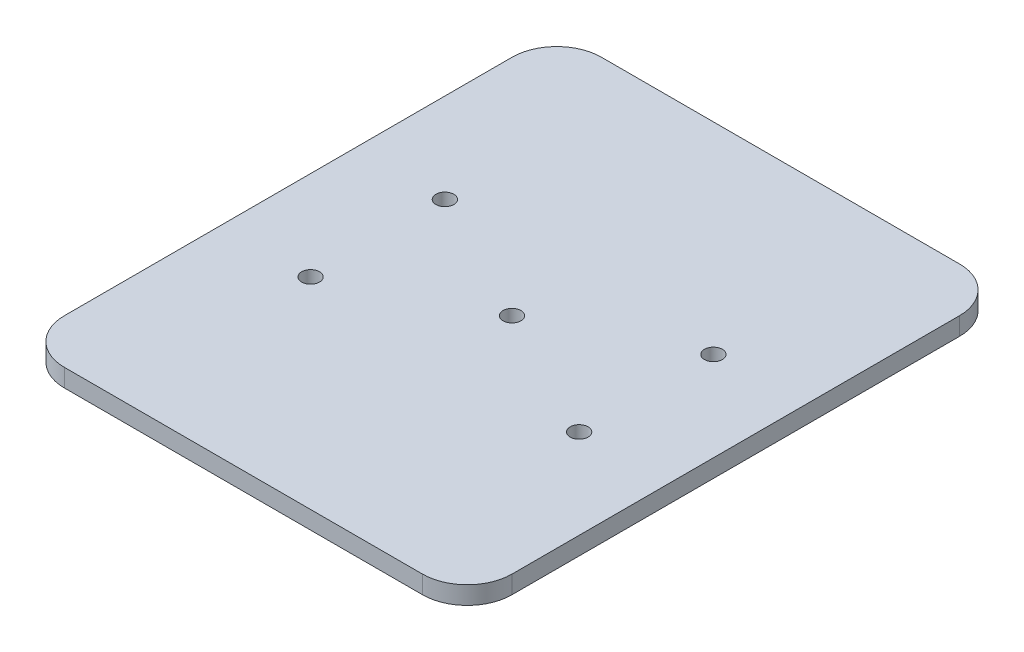
ISO-10303-21;
HEADER;
FILE_DESCRIPTION(('STEP AP214'),'2;1');
FILE_NAME('part.step','',(''),(''),'','','');
FILE_SCHEMA(('AUTOMOTIVE_DESIGN { 1 0 10303 214 1 1 1 1 }'));
ENDSEC;
DATA;
#1=APPLICATION_CONTEXT('core data for automotive mechanical design processes');
#2=APPLICATION_PROTOCOL_DEFINITION('international standard','automotive_design',2000,#1);
#3=PRODUCT_CONTEXT('',#1,'mechanical');
#4=PRODUCT('Part','Part','',(#3));
#5=PRODUCT_RELATED_PRODUCT_CATEGORY('part','',(#4));
#6=PRODUCT_DEFINITION_FORMATION('','',#4);
#7=PRODUCT_DEFINITION_CONTEXT('part definition',#1,'design');
#8=PRODUCT_DEFINITION('design','',#6,#7);
#9=PRODUCT_DEFINITION_SHAPE('','',#8);
#10=(LENGTH_UNIT() NAMED_UNIT(*) SI_UNIT(.MILLI.,.METRE.));
#11=(NAMED_UNIT(*) PLANE_ANGLE_UNIT() SI_UNIT($,.RADIAN.));
#12=(NAMED_UNIT(*) SI_UNIT($,.STERADIAN.) SOLID_ANGLE_UNIT());
#13=UNCERTAINTY_MEASURE_WITH_UNIT(LENGTH_MEASURE(1.E-05),#10,'distance_accuracy_value','');
#14=(GEOMETRIC_REPRESENTATION_CONTEXT(3) GLOBAL_UNCERTAINTY_ASSIGNED_CONTEXT((#13)) GLOBAL_UNIT_ASSIGNED_CONTEXT((#10,
#11,#12)) REPRESENTATION_CONTEXT('',''));
#15=CARTESIAN_POINT('',(0.,0.,0.));
#16=DIRECTION('',(0.,0.,1.));
#17=DIRECTION('',(1.,0.,0.));
#18=AXIS2_PLACEMENT_3D('',#15,#16,#17);
#19=CARTESIAN_POINT('',(-52.2549019607844,2.,28.7254901960784));
#20=DIRECTION('',(0.,1.,0.));
#21=DIRECTION('',(0.,0.,1.));
#22=AXIS2_PLACEMENT_3D('',#19,#20,#21);
#23=PLANE('',#22);
#24=CARTESIAN_POINT('',(-17.2549019607844,2.,-3.77450980392158));
#25=DIRECTION('',(0.,1.,0.));
#26=DIRECTION('',(0.,0.,1.));
#27=AXIS2_PLACEMENT_3D('',#24,#25,#26);
#28=CIRCLE('',#27,1.);
#29=CARTESIAN_POINT('',(-17.2549019607844,2.,-2.77450980392158));
#30=VERTEX_POINT('',#29);
#31=EDGE_CURVE('E202',#30,#30,#28,.T.);
#32=ORIENTED_EDGE('',*,*,#31,.F.);
#33=EDGE_LOOP('',(#32));
#34=FACE_BOUND('',#33,.T.);
#35=CARTESIAN_POINT('',(-47.2549019607844,2.,-3.77450980392158));
#36=DIRECTION('',(0.,1.,0.));
#37=DIRECTION('',(0.,0.,1.));
#38=AXIS2_PLACEMENT_3D('',#35,#36,#37);
#39=CIRCLE('',#38,0.999999999999998);
#40=CARTESIAN_POINT('',(-47.2549019607844,2.,-2.77450980392158));
#41=VERTEX_POINT('',#40);
#42=EDGE_CURVE('E190',#41,#41,#39,.T.);
#43=ORIENTED_EDGE('',*,*,#42,.F.);
#44=EDGE_LOOP('',(#43));
#45=FACE_BOUND('',#44,.T.);
#46=CARTESIAN_POINT('',(-52.2549019607844,2.,28.7254901960784));
#47=DIRECTION('',(0.,1.,0.));
#48=DIRECTION('',(0.,0.,1.));
#49=AXIS2_PLACEMENT_3D('',#46,#47,#48);
#50=CIRCLE('',#49,5.);
#51=CARTESIAN_POINT('',(-57.2549019607844,2.,28.7254901960784));
#52=VERTEX_POINT('',#51);
#53=CARTESIAN_POINT('',(-52.2549019607843,2.,33.7254901960784));
#54=VERTEX_POINT('',#53);
#55=EDGE_CURVE('E153',#52,#54,#50,.T.);
#56=ORIENTED_EDGE('',*,*,#55,.T.);
#57=DIRECTION('',(1.,0.,0.));
#58=VECTOR('',#57,1.);
#59=CARTESIAN_POINT('',(-52.2549019607843,2.,33.7254901960784));
#60=LINE('',#59,#58);
#61=CARTESIAN_POINT('',(-12.2549019607844,2.,33.7254901960784));
#62=VERTEX_POINT('',#61);
#63=EDGE_CURVE('E101',#54,#62,#60,.T.);
#64=ORIENTED_EDGE('',*,*,#63,.T.);
#65=CARTESIAN_POINT('',(-12.2549019607843,2.,28.7254901960784));
#66=DIRECTION('',(0.,1.,0.));
#67=DIRECTION('',(0.,0.,1.));
#68=AXIS2_PLACEMENT_3D('',#65,#66,#67);
#69=CIRCLE('',#68,5.);
#70=CARTESIAN_POINT('',(-7.25490196078435,2.,28.7254901960784));
#71=VERTEX_POINT('',#70);
#72=EDGE_CURVE('E168',#62,#71,#69,.T.);
#73=ORIENTED_EDGE('',*,*,#72,.T.);
#74=DIRECTION('',(0.,0.,-1.));
#75=VECTOR('',#74,1.);
#76=CARTESIAN_POINT('',(-7.25490196078435,2.,-21.2745098039215));
#77=LINE('',#76,#75);
#78=CARTESIAN_POINT('',(-7.25490196078435,2.,-21.2745098039215));
#79=VERTEX_POINT('',#78);
#80=EDGE_CURVE('E181',#71,#79,#77,.T.);
#81=ORIENTED_EDGE('',*,*,#80,.T.);
#82=CARTESIAN_POINT('',(-12.2549019607843,2.,-21.2745098039216));
#83=DIRECTION('',(0.,1.,0.));
#84=DIRECTION('',(0.,0.,-1.));
#85=AXIS2_PLACEMENT_3D('',#82,#83,#84);
#86=CIRCLE('',#85,5.);
#87=CARTESIAN_POINT('',(-12.2549019607844,2.,-26.2745098039216));
#88=VERTEX_POINT('',#87);
#89=EDGE_CURVE('E120',#79,#88,#86,.T.);
#90=ORIENTED_EDGE('',*,*,#89,.T.);
#91=DIRECTION('',(-1.,0.,0.));
#92=VECTOR('',#91,1.);
#93=CARTESIAN_POINT('',(-52.2549019607843,2.,-26.2745098039216));
#94=LINE('',#93,#92);
#95=CARTESIAN_POINT('',(-52.2549019607843,2.,-26.2745098039216));
#96=VERTEX_POINT('',#95);
#97=EDGE_CURVE('E114',#88,#96,#94,.T.);
#98=ORIENTED_EDGE('',*,*,#97,.T.);
#99=CARTESIAN_POINT('',(-52.2549019607844,2.,-21.2745098039216));
#100=DIRECTION('',(0.,1.,0.));
#101=DIRECTION('',(0.,0.,1.));
#102=AXIS2_PLACEMENT_3D('',#99,#100,#101);
#103=CIRCLE('',#102,5.);
#104=CARTESIAN_POINT('',(-57.2549019607844,2.,-21.2745098039215));
#105=VERTEX_POINT('',#104);
#106=EDGE_CURVE('E118',#96,#105,#103,.T.);
#107=ORIENTED_EDGE('',*,*,#106,.T.);
#108=DIRECTION('',(0.,0.,1.));
#109=VECTOR('',#108,1.);
#110=CARTESIAN_POINT('',(-57.2549019607844,2.,-21.2745098039215));
#111=LINE('',#110,#109);
#112=EDGE_CURVE('E58',#105,#52,#111,.T.);
#113=ORIENTED_EDGE('',*,*,#112,.T.);
#114=EDGE_LOOP('',(#56,#64,#73,#81,#90,#98,#107,#113));
#115=FACE_BOUND('',#114,.T.);
#116=CARTESIAN_POINT('',(-32.2549019607844,2.,3.72549019607842));
#117=DIRECTION('',(0.,1.,0.));
#118=DIRECTION('',(0.,0.,1.));
#119=AXIS2_PLACEMENT_3D('',#116,#117,#118);
#120=CIRCLE('',#119,0.999999999999998);
#121=CARTESIAN_POINT('',(-32.2549019607844,2.,4.72549019607842));
#122=VERTEX_POINT('',#121);
#123=EDGE_CURVE('E142',#122,#122,#120,.T.);
#124=ORIENTED_EDGE('',*,*,#123,.F.);
#125=EDGE_LOOP('',(#124));
#126=FACE_BOUND('',#125,.T.);
#127=CARTESIAN_POINT('',(-47.2549019607844,2.,11.2254901960784));
#128=DIRECTION('',(0.,1.,0.));
#129=DIRECTION('',(0.,0.,1.));
#130=AXIS2_PLACEMENT_3D('',#127,#128,#129);
#131=CIRCLE('',#130,0.999999999999998);
#132=CARTESIAN_POINT('',(-47.2549019607844,2.,12.2254901960784));
#133=VERTEX_POINT('',#132);
#134=EDGE_CURVE('E196',#133,#133,#131,.T.);
#135=ORIENTED_EDGE('',*,*,#134,.F.);
#136=EDGE_LOOP('',(#135));
#137=FACE_BOUND('',#136,.T.);
#138=CARTESIAN_POINT('',(-17.2549019607844,2.,11.2254901960784));
#139=DIRECTION('',(0.,1.,0.));
#140=DIRECTION('',(0.,0.,1.));
#141=AXIS2_PLACEMENT_3D('',#138,#139,#140);
#142=CIRCLE('',#141,1.);
#143=CARTESIAN_POINT('',(-17.2549019607844,2.,12.2254901960784));
#144=VERTEX_POINT('',#143);
#145=EDGE_CURVE('E208',#144,#144,#142,.T.);
#146=ORIENTED_EDGE('',*,*,#145,.F.);
#147=EDGE_LOOP('',(#146));
#148=FACE_BOUND('',#147,.T.);
#149=ADVANCED_FACE('F41',(#34,#45,#115,#126,#137,#148),#23,.T.);
#150=CARTESIAN_POINT('',(-52.2549019607844,0.,28.7254901960784));
#151=DIRECTION('',(0.,1.,0.));
#152=DIRECTION('',(0.,0.,1.));
#153=AXIS2_PLACEMENT_3D('',#150,#151,#152);
#154=PLANE('',#153);
#155=CARTESIAN_POINT('',(-52.2549019607844,0.,28.7254901960784));
#156=DIRECTION('',(0.,1.,0.));
#157=DIRECTION('',(0.,0.,1.));
#158=AXIS2_PLACEMENT_3D('',#155,#156,#157);
#159=CIRCLE('',#158,5.);
#160=CARTESIAN_POINT('',(-57.2549019607844,0.,28.7254901960784));
#161=VERTEX_POINT('',#160);
#162=CARTESIAN_POINT('',(-52.2549019607843,0.,33.7254901960784));
#163=VERTEX_POINT('',#162);
#164=EDGE_CURVE('E138',#161,#163,#159,.T.);
#165=ORIENTED_EDGE('',*,*,#164,.F.);
#166=DIRECTION('',(0.,0.,1.));
#167=VECTOR('',#166,1.);
#168=CARTESIAN_POINT('',(-57.2549019607844,0.,-21.2745098039215));
#169=LINE('',#168,#167);
#170=CARTESIAN_POINT('',(-57.2549019607844,0.,-21.2745098039215));
#171=VERTEX_POINT('',#170);
#172=EDGE_CURVE('E93',#171,#161,#169,.T.);
#173=ORIENTED_EDGE('',*,*,#172,.F.);
#174=CARTESIAN_POINT('',(-52.2549019607844,0.,-21.2745098039216));
#175=DIRECTION('',(0.,1.,0.));
#176=DIRECTION('',(0.,0.,1.));
#177=AXIS2_PLACEMENT_3D('',#174,#175,#176);
#178=CIRCLE('',#177,5.);
#179=CARTESIAN_POINT('',(-52.2549019607843,0.,-26.2745098039216));
#180=VERTEX_POINT('',#179);
#181=EDGE_CURVE('E87',#180,#171,#178,.T.);
#182=ORIENTED_EDGE('',*,*,#181,.F.);
#183=DIRECTION('',(-1.,0.,0.));
#184=VECTOR('',#183,1.);
#185=CARTESIAN_POINT('',(-52.2549019607843,0.,-26.2745098039216));
#186=LINE('',#185,#184);
#187=CARTESIAN_POINT('',(-12.2549019607844,0.,-26.2745098039216));
#188=VERTEX_POINT('',#187);
#189=EDGE_CURVE('E128',#188,#180,#186,.T.);
#190=ORIENTED_EDGE('',*,*,#189,.F.);
#191=CARTESIAN_POINT('',(-12.2549019607843,0.,-21.2745098039216));
#192=DIRECTION('',(0.,1.,0.));
#193=DIRECTION('',(0.,0.,-1.));
#194=AXIS2_PLACEMENT_3D('',#191,#192,#193);
#195=CIRCLE('',#194,5.);
#196=CARTESIAN_POINT('',(-7.25490196078435,0.,-21.2745098039215));
#197=VERTEX_POINT('',#196);
#198=EDGE_CURVE('E148',#197,#188,#195,.T.);
#199=ORIENTED_EDGE('',*,*,#198,.F.);
#200=DIRECTION('',(0.,0.,-1.));
#201=VECTOR('',#200,1.);
#202=CARTESIAN_POINT('',(-7.25490196078435,0.,-21.2745098039215));
#203=LINE('',#202,#201);
#204=CARTESIAN_POINT('',(-7.25490196078435,0.,28.7254901960784));
#205=VERTEX_POINT('',#204);
#206=EDGE_CURVE('E146',#205,#197,#203,.T.);
#207=ORIENTED_EDGE('',*,*,#206,.F.);
#208=CARTESIAN_POINT('',(-12.2549019607843,0.,28.7254901960784));
#209=DIRECTION('',(0.,1.,0.));
#210=DIRECTION('',(0.,0.,1.));
#211=AXIS2_PLACEMENT_3D('',#208,#209,#210);
#212=CIRCLE('',#211,5.);
#213=CARTESIAN_POINT('',(-12.2549019607844,0.,33.7254901960784));
#214=VERTEX_POINT('',#213);
#215=EDGE_CURVE('E144',#214,#205,#212,.T.);
#216=ORIENTED_EDGE('',*,*,#215,.F.);
#217=DIRECTION('',(1.,0.,0.));
#218=VECTOR('',#217,1.);
#219=CARTESIAN_POINT('',(-52.2549019607843,0.,33.7254901960784));
#220=LINE('',#219,#218);
#221=EDGE_CURVE('E141',#163,#214,#220,.T.);
#222=ORIENTED_EDGE('',*,*,#221,.F.);
#223=EDGE_LOOP('',(#165,#173,#182,#190,#199,#207,#216,#222));
#224=FACE_BOUND('',#223,.T.);
#225=CARTESIAN_POINT('',(-32.2549019607844,0.,3.72549019607842));
#226=DIRECTION('',(0.,1.,0.));
#227=DIRECTION('',(0.,0.,1.));
#228=AXIS2_PLACEMENT_3D('',#225,#226,#227);
#229=CIRCLE('',#228,0.999999999999998);
#230=CARTESIAN_POINT('',(-32.2549019607844,0.,4.72549019607842));
#231=VERTEX_POINT('',#230);
#232=EDGE_CURVE('E187',#231,#231,#229,.T.);
#233=ORIENTED_EDGE('',*,*,#232,.T.);
#234=EDGE_LOOP('',(#233));
#235=FACE_BOUND('',#234,.T.);
#236=CARTESIAN_POINT('',(-47.2549019607844,0.,-3.77450980392158));
#237=DIRECTION('',(0.,1.,0.));
#238=DIRECTION('',(0.,0.,1.));
#239=AXIS2_PLACEMENT_3D('',#236,#237,#238);
#240=CIRCLE('',#239,0.999999999999998);
#241=CARTESIAN_POINT('',(-47.2549019607844,0.,-2.77450980392158));
#242=VERTEX_POINT('',#241);
#243=EDGE_CURVE('E193',#242,#242,#240,.T.);
#244=ORIENTED_EDGE('',*,*,#243,.T.);
#245=EDGE_LOOP('',(#244));
#246=FACE_BOUND('',#245,.T.);
#247=CARTESIAN_POINT('',(-47.2549019607844,0.,11.2254901960784));
#248=DIRECTION('',(0.,1.,0.));
#249=DIRECTION('',(0.,0.,1.));
#250=AXIS2_PLACEMENT_3D('',#247,#248,#249);
#251=CIRCLE('',#250,0.999999999999998);
#252=CARTESIAN_POINT('',(-47.2549019607844,0.,12.2254901960784));
#253=VERTEX_POINT('',#252);
#254=EDGE_CURVE('E199',#253,#253,#251,.T.);
#255=ORIENTED_EDGE('',*,*,#254,.T.);
#256=EDGE_LOOP('',(#255));
#257=FACE_BOUND('',#256,.T.);
#258=CARTESIAN_POINT('',(-17.2549019607844,0.,-3.77450980392158));
#259=DIRECTION('',(0.,1.,0.));
#260=DIRECTION('',(0.,0.,1.));
#261=AXIS2_PLACEMENT_3D('',#258,#259,#260);
#262=CIRCLE('',#261,1.);
#263=CARTESIAN_POINT('',(-17.2549019607844,0.,-2.77450980392158));
#264=VERTEX_POINT('',#263);
#265=EDGE_CURVE('E205',#264,#264,#262,.T.);
#266=ORIENTED_EDGE('',*,*,#265,.T.);
#267=EDGE_LOOP('',(#266));
#268=FACE_BOUND('',#267,.T.);
#269=CARTESIAN_POINT('',(-17.2549019607844,0.,11.2254901960784));
#270=DIRECTION('',(0.,1.,0.));
#271=DIRECTION('',(0.,0.,1.));
#272=AXIS2_PLACEMENT_3D('',#269,#270,#271);
#273=CIRCLE('',#272,1.);
#274=CARTESIAN_POINT('',(-17.2549019607844,0.,12.2254901960784));
#275=VERTEX_POINT('',#274);
#276=EDGE_CURVE('E211',#275,#275,#273,.T.);
#277=ORIENTED_EDGE('',*,*,#276,.T.);
#278=EDGE_LOOP('',(#277));
#279=FACE_BOUND('',#278,.T.);
#280=ADVANCED_FACE('F172',(#224,#235,#246,#257,#268,#279),#154,.F.);
#281=CARTESIAN_POINT('',(-52.2549019607844,2.,28.7254901960784));
#282=DIRECTION('',(0.,-1.,0.));
#283=DIRECTION('',(0.,0.,-1.));
#284=AXIS2_PLACEMENT_3D('',#281,#282,#283);
#285=CYLINDRICAL_SURFACE('',#284,5.);
#286=ORIENTED_EDGE('',*,*,#164,.T.);
#287=DIRECTION('',(0.,-1.,0.));
#288=VECTOR('',#287,1.);
#289=CARTESIAN_POINT('',(-52.2549019607843,2.,33.7254901960784));
#290=LINE('',#289,#288);
#291=EDGE_CURVE('E11',#54,#163,#290,.T.);
#292=ORIENTED_EDGE('',*,*,#291,.F.);
#293=ORIENTED_EDGE('',*,*,#55,.F.);
#294=DIRECTION('',(0.,-1.,0.));
#295=VECTOR('',#294,1.);
#296=CARTESIAN_POINT('',(-57.2549019607844,2.,28.7254901960784));
#297=LINE('',#296,#295);
#298=EDGE_CURVE('E134',#52,#161,#297,.T.);
#299=ORIENTED_EDGE('',*,*,#298,.T.);
#300=EDGE_LOOP('',(#286,#292,#293,#299));
#301=FACE_BOUND('',#300,.T.);
#302=ADVANCED_FACE('F43',(#301),#285,.T.);
#303=CARTESIAN_POINT('',(-52.2549019607843,2.,33.7254901960784));
#304=DIRECTION('',(0.,0.,-1.));
#305=DIRECTION('',(-1.,0.,0.));
#306=AXIS2_PLACEMENT_3D('',#303,#304,#305);
#307=PLANE('',#306);
#308=ORIENTED_EDGE('',*,*,#221,.T.);
#309=DIRECTION('',(0.,-1.,0.));
#310=VECTOR('',#309,1.);
#311=CARTESIAN_POINT('',(-12.2549019607844,2.,33.7254901960784));
#312=LINE('',#311,#310);
#313=EDGE_CURVE('E50',#62,#214,#312,.T.);
#314=ORIENTED_EDGE('',*,*,#313,.F.);
#315=ORIENTED_EDGE('',*,*,#63,.F.);
#316=ORIENTED_EDGE('',*,*,#291,.T.);
#317=EDGE_LOOP('',(#308,#314,#315,#316));
#318=FACE_BOUND('',#317,.T.);
#319=ADVANCED_FACE('F245',(#318),#307,.F.);
#320=CARTESIAN_POINT('',(-12.2549019607843,2.,28.7254901960784));
#321=DIRECTION('',(0.,-1.,0.));
#322=DIRECTION('',(0.,0.,-1.));
#323=AXIS2_PLACEMENT_3D('',#320,#321,#322);
#324=CYLINDRICAL_SURFACE('',#323,5.);
#325=ORIENTED_EDGE('',*,*,#215,.T.);
#326=DIRECTION('',(0.,-1.,0.));
#327=VECTOR('',#326,1.);
#328=CARTESIAN_POINT('',(-7.25490196078435,2.,28.7254901960784));
#329=LINE('',#328,#327);
#330=EDGE_CURVE('E160',#71,#205,#329,.T.);
#331=ORIENTED_EDGE('',*,*,#330,.F.);
#332=ORIENTED_EDGE('',*,*,#72,.F.);
#333=ORIENTED_EDGE('',*,*,#313,.T.);
#334=EDGE_LOOP('',(#325,#331,#332,#333));
#335=FACE_BOUND('',#334,.T.);
#336=ADVANCED_FACE('F166',(#335),#324,.T.);
#337=CARTESIAN_POINT('',(-7.25490196078435,2.,-21.2745098039215));
#338=DIRECTION('',(-1.,0.,0.));
#339=DIRECTION('',(0.,0.,1.));
#340=AXIS2_PLACEMENT_3D('',#337,#338,#339);
#341=PLANE('',#340);
#342=ORIENTED_EDGE('',*,*,#206,.T.);
#343=DIRECTION('',(0.,-1.,0.));
#344=VECTOR('',#343,1.);
#345=CARTESIAN_POINT('',(-7.25490196078435,2.,-21.2745098039215));
#346=LINE('',#345,#344);
#347=EDGE_CURVE('E157',#79,#197,#346,.T.);
#348=ORIENTED_EDGE('',*,*,#347,.F.);
#349=ORIENTED_EDGE('',*,*,#80,.F.);
#350=ORIENTED_EDGE('',*,*,#330,.T.);
#351=EDGE_LOOP('',(#342,#348,#349,#350));
#352=FACE_BOUND('',#351,.T.);
#353=ADVANCED_FACE('F177',(#352),#341,.F.);
#354=CARTESIAN_POINT('',(-12.2549019607843,2.,-21.2745098039216));
#355=DIRECTION('',(0.,-1.,0.));
#356=DIRECTION('',(0.,0.,-1.));
#357=AXIS2_PLACEMENT_3D('',#354,#355,#356);
#358=CYLINDRICAL_SURFACE('',#357,5.);
#359=ORIENTED_EDGE('',*,*,#198,.T.);
#360=DIRECTION('',(0.,-1.,0.));
#361=VECTOR('',#360,1.);
#362=CARTESIAN_POINT('',(-12.2549019607844,2.,-26.2745098039216));
#363=LINE('',#362,#361);
#364=EDGE_CURVE('E129',#88,#188,#363,.T.);
#365=ORIENTED_EDGE('',*,*,#364,.F.);
#366=ORIENTED_EDGE('',*,*,#89,.F.);
#367=ORIENTED_EDGE('',*,*,#347,.T.);
#368=EDGE_LOOP('',(#359,#365,#366,#367));
#369=FACE_BOUND('',#368,.T.);
#370=ADVANCED_FACE('F180',(#369),#358,.T.);
#371=CARTESIAN_POINT('',(-52.2549019607843,2.,-26.2745098039216));
#372=DIRECTION('',(0.,0.,1.));
#373=DIRECTION('',(1.,0.,0.));
#374=AXIS2_PLACEMENT_3D('',#371,#372,#373);
#375=PLANE('',#374);
#376=ORIENTED_EDGE('',*,*,#189,.T.);
#377=DIRECTION('',(0.,-1.,0.));
#378=VECTOR('',#377,1.);
#379=CARTESIAN_POINT('',(-52.2549019607843,2.,-26.2745098039216));
#380=LINE('',#379,#378);
#381=EDGE_CURVE('E125',#96,#180,#380,.T.);
#382=ORIENTED_EDGE('',*,*,#381,.F.);
#383=ORIENTED_EDGE('',*,*,#97,.F.);
#384=ORIENTED_EDGE('',*,*,#364,.T.);
#385=EDGE_LOOP('',(#376,#382,#383,#384));
#386=FACE_BOUND('',#385,.T.);
#387=ADVANCED_FACE('F126',(#386),#375,.F.);
#388=CARTESIAN_POINT('',(-52.2549019607844,2.,-21.2745098039216));
#389=DIRECTION('',(0.,-1.,0.));
#390=DIRECTION('',(0.,0.,-1.));
#391=AXIS2_PLACEMENT_3D('',#388,#389,#390);
#392=CYLINDRICAL_SURFACE('',#391,5.);
#393=ORIENTED_EDGE('',*,*,#181,.T.);
#394=DIRECTION('',(0.,-1.,0.));
#395=VECTOR('',#394,1.);
#396=CARTESIAN_POINT('',(-57.2549019607844,2.,-21.2745098039215));
#397=LINE('',#396,#395);
#398=EDGE_CURVE('E130',#105,#171,#397,.T.);
#399=ORIENTED_EDGE('',*,*,#398,.F.);
#400=ORIENTED_EDGE('',*,*,#106,.F.);
#401=ORIENTED_EDGE('',*,*,#381,.T.);
#402=EDGE_LOOP('',(#393,#399,#400,#401));
#403=FACE_BOUND('',#402,.T.);
#404=ADVANCED_FACE('F132',(#403),#392,.T.);
#405=CARTESIAN_POINT('',(-57.2549019607844,2.,-21.2745098039215));
#406=DIRECTION('',(1.,0.,0.));
#407=DIRECTION('',(0.,0.,-1.));
#408=AXIS2_PLACEMENT_3D('',#405,#406,#407);
#409=PLANE('',#408);
#410=ORIENTED_EDGE('',*,*,#172,.T.);
#411=ORIENTED_EDGE('',*,*,#298,.F.);
#412=ORIENTED_EDGE('',*,*,#112,.F.);
#413=ORIENTED_EDGE('',*,*,#398,.T.);
#414=EDGE_LOOP('',(#410,#411,#412,#413));
#415=FACE_BOUND('',#414,.T.);
#416=ADVANCED_FACE('F233',(#415),#409,.F.);
#417=CARTESIAN_POINT('',(-32.2549019607844,2.,3.72549019607842));
#418=DIRECTION('',(0.,-1.,0.));
#419=DIRECTION('',(0.,0.,-1.));
#420=AXIS2_PLACEMENT_3D('',#417,#418,#419);
#421=CYLINDRICAL_SURFACE('',#420,0.999999999999998);
#422=ORIENTED_EDGE('',*,*,#123,.T.);
#423=EDGE_LOOP('',(#422));
#424=FACE_BOUND('',#423,.T.);
#425=ORIENTED_EDGE('',*,*,#232,.F.);
#426=EDGE_LOOP('',(#425));
#427=FACE_BOUND('',#426,.T.);
#428=ADVANCED_FACE('F230',(#424,#427),#421,.F.);
#429=CARTESIAN_POINT('',(-47.2549019607844,2.,-3.77450980392158));
#430=DIRECTION('',(0.,-1.,0.));
#431=DIRECTION('',(0.,0.,-1.));
#432=AXIS2_PLACEMENT_3D('',#429,#430,#431);
#433=CYLINDRICAL_SURFACE('',#432,0.999999999999998);
#434=ORIENTED_EDGE('',*,*,#42,.T.);
#435=EDGE_LOOP('',(#434));
#436=FACE_BOUND('',#435,.T.);
#437=ORIENTED_EDGE('',*,*,#243,.F.);
#438=EDGE_LOOP('',(#437));
#439=FACE_BOUND('',#438,.T.);
#440=ADVANCED_FACE('F321',(#436,#439),#433,.F.);
#441=CARTESIAN_POINT('',(-47.2549019607844,2.,11.2254901960784));
#442=DIRECTION('',(0.,-1.,0.));
#443=DIRECTION('',(0.,0.,-1.));
#444=AXIS2_PLACEMENT_3D('',#441,#442,#443);
#445=CYLINDRICAL_SURFACE('',#444,0.999999999999998);
#446=ORIENTED_EDGE('',*,*,#134,.T.);
#447=EDGE_LOOP('',(#446));
#448=FACE_BOUND('',#447,.T.);
#449=ORIENTED_EDGE('',*,*,#254,.F.);
#450=EDGE_LOOP('',(#449));
#451=FACE_BOUND('',#450,.T.);
#452=ADVANCED_FACE('F330',(#448,#451),#445,.F.);
#453=CARTESIAN_POINT('',(-17.2549019607844,2.,-3.77450980392158));
#454=DIRECTION('',(0.,-1.,0.));
#455=DIRECTION('',(0.,0.,-1.));
#456=AXIS2_PLACEMENT_3D('',#453,#454,#455);
#457=CYLINDRICAL_SURFACE('',#456,1.);
#458=ORIENTED_EDGE('',*,*,#31,.T.);
#459=EDGE_LOOP('',(#458));
#460=FACE_BOUND('',#459,.T.);
#461=ORIENTED_EDGE('',*,*,#265,.F.);
#462=EDGE_LOOP('',(#461));
#463=FACE_BOUND('',#462,.T.);
#464=ADVANCED_FACE('F339',(#460,#463),#457,.F.);
#465=CARTESIAN_POINT('',(-17.2549019607844,2.,11.2254901960784));
#466=DIRECTION('',(0.,-1.,0.));
#467=DIRECTION('',(0.,0.,-1.));
#468=AXIS2_PLACEMENT_3D('',#465,#466,#467);
#469=CYLINDRICAL_SURFACE('',#468,1.);
#470=ORIENTED_EDGE('',*,*,#145,.T.);
#471=EDGE_LOOP('',(#470));
#472=FACE_BOUND('',#471,.T.);
#473=ORIENTED_EDGE('',*,*,#276,.F.);
#474=EDGE_LOOP('',(#473));
#475=FACE_BOUND('',#474,.T.);
#476=ADVANCED_FACE('F217',(#472,#475),#469,.F.);
#477=CLOSED_SHELL('',(#149,#280,#302,#319,#336,#353,#370,#387,#404,#416,#428,#440,#452,#464,#476));
#478=MANIFOLD_SOLID_BREP('B2',#477);
#479=ADVANCED_BREP_SHAPE_REPRESENTATION('',(#18,#478),#14);
#480=SHAPE_DEFINITION_REPRESENTATION(#9,#479);
ENDSEC;
END-ISO-10303-21;
